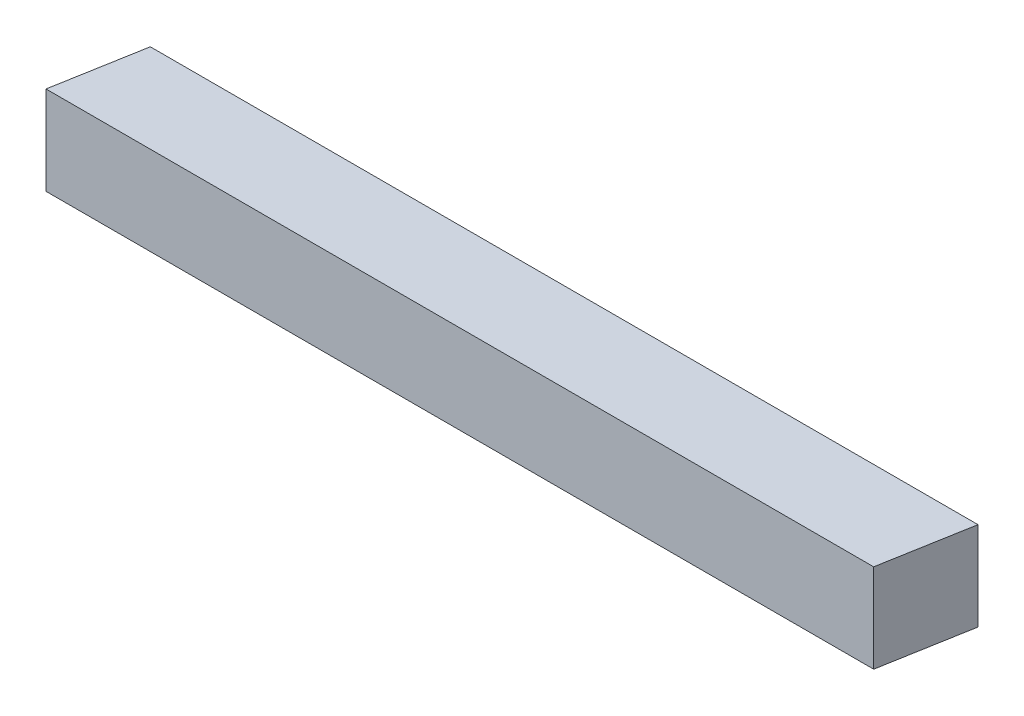
ISO-10303-21;
HEADER;
FILE_DESCRIPTION(('STEP AP214'),'2;1');
FILE_NAME('part.step','',(''),(''),'','','');
FILE_SCHEMA(('AUTOMOTIVE_DESIGN { 1 0 10303 214 1 1 1 1 }'));
ENDSEC;
DATA;
#1=APPLICATION_CONTEXT('core data for automotive mechanical design processes');
#2=APPLICATION_PROTOCOL_DEFINITION('international standard','automotive_design',2000,#1);
#3=PRODUCT_CONTEXT('',#1,'mechanical');
#4=PRODUCT('Part','Part','',(#3));
#5=PRODUCT_RELATED_PRODUCT_CATEGORY('part','',(#4));
#6=PRODUCT_DEFINITION_FORMATION('','',#4);
#7=PRODUCT_DEFINITION_CONTEXT('part definition',#1,'design');
#8=PRODUCT_DEFINITION('design','',#6,#7);
#9=PRODUCT_DEFINITION_SHAPE('','',#8);
#10=(LENGTH_UNIT() NAMED_UNIT(*) SI_UNIT(.MILLI.,.METRE.));
#11=(NAMED_UNIT(*) PLANE_ANGLE_UNIT() SI_UNIT($,.RADIAN.));
#12=(NAMED_UNIT(*) SI_UNIT($,.STERADIAN.) SOLID_ANGLE_UNIT());
#13=UNCERTAINTY_MEASURE_WITH_UNIT(LENGTH_MEASURE(1.E-05),#10,'distance_accuracy_value','');
#14=(GEOMETRIC_REPRESENTATION_CONTEXT(3) GLOBAL_UNCERTAINTY_ASSIGNED_CONTEXT((#13)) GLOBAL_UNIT_ASSIGNED_CONTEXT((#10,
#11,#12)) REPRESENTATION_CONTEXT('',''));
#15=CARTESIAN_POINT('',(0.,0.,0.));
#16=DIRECTION('',(0.,0.,1.));
#17=DIRECTION('',(1.,0.,0.));
#18=AXIS2_PLACEMENT_3D('',#15,#16,#17);
#19=CARTESIAN_POINT('',(-30.7387730658491,19.05,22.5433161953728));
#20=DIRECTION('',(0.,0.,1.));
#21=DIRECTION('',(1.,0.,0.));
#22=AXIS2_PLACEMENT_3D('',#19,#20,#21);
#23=PLANE('',#22);
#24=DIRECTION('',(-1.,0.,0.));
#25=VECTOR('',#24,1.);
#26=CARTESIAN_POINT('',(-30.7387730658491,0.,22.5433161953728));
#27=LINE('',#26,#25);
#28=CARTESIAN_POINT('',(147.061226934151,0.,22.5433161953728));
#29=VERTEX_POINT('',#28);
#30=CARTESIAN_POINT('',(-30.7387730658491,0.,22.5433161953728));
#31=VERTEX_POINT('',#30);
#32=EDGE_CURVE('E105',#29,#31,#27,.T.);
#33=ORIENTED_EDGE('',*,*,#32,.T.);
#34=DIRECTION('',(0.,-1.,0.));
#35=VECTOR('',#34,1.);
#36=CARTESIAN_POINT('',(-30.7387730658491,19.05,22.5433161953728));
#37=LINE('',#36,#35);
#38=CARTESIAN_POINT('',(-30.7387730658491,19.05,22.5433161953728));
#39=VERTEX_POINT('',#38);
#40=EDGE_CURVE('E11',#39,#31,#37,.T.);
#41=ORIENTED_EDGE('',*,*,#40,.F.);
#42=DIRECTION('',(-1.,0.,0.));
#43=VECTOR('',#42,1.);
#44=CARTESIAN_POINT('',(-30.7387730658491,19.05,22.5433161953728));
#45=LINE('',#44,#43);
#46=CARTESIAN_POINT('',(147.061226934151,19.05,22.5433161953728));
#47=VERTEX_POINT('',#46);
#48=EDGE_CURVE('E89',#47,#39,#45,.T.);
#49=ORIENTED_EDGE('',*,*,#48,.F.);
#50=DIRECTION('',(0.,-1.,0.));
#51=VECTOR('',#50,1.);
#52=CARTESIAN_POINT('',(147.061226934151,19.05,22.5433161953728));
#53=LINE('',#52,#51);
#54=EDGE_CURVE('E97',#47,#29,#53,.T.);
#55=ORIENTED_EDGE('',*,*,#54,.T.);
#56=EDGE_LOOP('',(#33,#41,#49,#55));
#57=FACE_BOUND('',#56,.T.);
#58=ADVANCED_FACE('F39',(#57),#23,.F.);
#59=CARTESIAN_POINT('',(-34.0978020483455,19.05,41.5933161953728));
#60=DIRECTION('',(0.984807753012207,0.,0.173648177666934));
#61=DIRECTION('',(0.173648177666934,0.,-0.984807753012207));
#62=AXIS2_PLACEMENT_3D('',#59,#60,#61);
#63=PLANE('',#62);
#64=DIRECTION('',(-0.173648177666934,0.,0.984807753012207));
#65=VECTOR('',#64,1.);
#66=CARTESIAN_POINT('',(-34.0978020483455,0.,41.5933161953728));
#67=LINE('',#66,#65);
#68=CARTESIAN_POINT('',(-34.0978020483455,0.,41.5933161953728));
#69=VERTEX_POINT('',#68);
#70=EDGE_CURVE('E92',#31,#69,#67,.T.);
#71=ORIENTED_EDGE('',*,*,#70,.T.);
#72=DIRECTION('',(0.,-1.,0.));
#73=VECTOR('',#72,1.);
#74=CARTESIAN_POINT('',(-34.0978020483455,19.05,41.5933161953728));
#75=LINE('',#74,#73);
#76=CARTESIAN_POINT('',(-34.0978020483455,19.05,41.5933161953728));
#77=VERTEX_POINT('',#76);
#78=EDGE_CURVE('E50',#77,#69,#75,.T.);
#79=ORIENTED_EDGE('',*,*,#78,.F.);
#80=DIRECTION('',(-0.173648177666934,0.,0.984807753012207));
#81=VECTOR('',#80,1.);
#82=CARTESIAN_POINT('',(-34.0978020483455,19.05,41.5933161953728));
#83=LINE('',#82,#81);
#84=EDGE_CURVE('E82',#39,#77,#83,.T.);
#85=ORIENTED_EDGE('',*,*,#84,.F.);
#86=ORIENTED_EDGE('',*,*,#40,.T.);
#87=EDGE_LOOP('',(#71,#79,#85,#86));
#88=FACE_BOUND('',#87,.T.);
#89=ADVANCED_FACE('F93',(#88),#63,.F.);
#90=CARTESIAN_POINT('',(143.702197951655,19.05,41.5933161953728));
#91=DIRECTION('',(0.,0.,-1.));
#92=DIRECTION('',(-1.,0.,0.));
#93=AXIS2_PLACEMENT_3D('',#90,#91,#92);
#94=PLANE('',#93);
#95=DIRECTION('',(1.,0.,0.));
#96=VECTOR('',#95,1.);
#97=CARTESIAN_POINT('',(143.702197951655,0.,41.5933161953728));
#98=LINE('',#97,#96);
#99=CARTESIAN_POINT('',(143.702197951655,0.,41.5933161953728));
#100=VERTEX_POINT('',#99);
#101=EDGE_CURVE('E72',#69,#100,#98,.T.);
#102=ORIENTED_EDGE('',*,*,#101,.T.);
#103=DIRECTION('',(0.,-1.,0.));
#104=VECTOR('',#103,1.);
#105=CARTESIAN_POINT('',(143.702197951655,19.05,41.5933161953728));
#106=LINE('',#105,#104);
#107=CARTESIAN_POINT('',(143.702197951655,19.05,41.5933161953728));
#108=VERTEX_POINT('',#107);
#109=EDGE_CURVE('E94',#108,#100,#106,.T.);
#110=ORIENTED_EDGE('',*,*,#109,.F.);
#111=DIRECTION('',(1.,0.,0.));
#112=VECTOR('',#111,1.);
#113=CARTESIAN_POINT('',(143.702197951655,19.05,41.5933161953728));
#114=LINE('',#113,#112);
#115=EDGE_CURVE('E88',#77,#108,#114,.T.);
#116=ORIENTED_EDGE('',*,*,#115,.F.);
#117=ORIENTED_EDGE('',*,*,#78,.T.);
#118=EDGE_LOOP('',(#102,#110,#116,#117));
#119=FACE_BOUND('',#118,.T.);
#120=ADVANCED_FACE('F96',(#119),#94,.F.);
#121=CARTESIAN_POINT('',(143.702197951655,19.05,41.5933161953728));
#122=DIRECTION('',(-0.984807753012209,0.,-0.173648177666927));
#123=DIRECTION('',(-0.173648177666927,0.,0.984807753012209));
#124=AXIS2_PLACEMENT_3D('',#121,#122,#123);
#125=PLANE('',#124);
#126=DIRECTION('',(0.173648177666927,0.,-0.984807753012209));
#127=VECTOR('',#126,1.);
#128=CARTESIAN_POINT('',(143.702197951655,0.,41.5933161953728));
#129=LINE('',#128,#127);
#130=EDGE_CURVE('E76',#100,#29,#129,.T.);
#131=ORIENTED_EDGE('',*,*,#130,.T.);
#132=ORIENTED_EDGE('',*,*,#54,.F.);
#133=DIRECTION('',(0.173648177666927,0.,-0.984807753012209));
#134=VECTOR('',#133,1.);
#135=CARTESIAN_POINT('',(143.702197951655,19.05,41.5933161953728));
#136=LINE('',#135,#134);
#137=EDGE_CURVE('E54',#108,#47,#136,.T.);
#138=ORIENTED_EDGE('',*,*,#137,.F.);
#139=ORIENTED_EDGE('',*,*,#109,.T.);
#140=EDGE_LOOP('',(#131,#132,#138,#139));
#141=FACE_BOUND('',#140,.T.);
#142=ADVANCED_FACE('F108',(#141),#125,.F.);
#143=CARTESIAN_POINT('',(0.,19.05,0.));
#144=DIRECTION('',(0.,1.,0.));
#145=DIRECTION('',(0.,0.,1.));
#146=AXIS2_PLACEMENT_3D('',#143,#144,#145);
#147=PLANE('',#146);
#148=ORIENTED_EDGE('',*,*,#48,.T.);
#149=ORIENTED_EDGE('',*,*,#84,.T.);
#150=ORIENTED_EDGE('',*,*,#115,.T.);
#151=ORIENTED_EDGE('',*,*,#137,.T.);
#152=EDGE_LOOP('',(#148,#149,#150,#151));
#153=FACE_BOUND('',#152,.T.);
#154=ADVANCED_FACE('F86',(#153),#147,.T.);
#155=CARTESIAN_POINT('',(0.,0.,0.));
#156=DIRECTION('',(0.,1.,0.));
#157=DIRECTION('',(0.,0.,1.));
#158=AXIS2_PLACEMENT_3D('',#155,#156,#157);
#159=PLANE('',#158);
#160=ORIENTED_EDGE('',*,*,#32,.F.);
#161=ORIENTED_EDGE('',*,*,#130,.F.);
#162=ORIENTED_EDGE('',*,*,#101,.F.);
#163=ORIENTED_EDGE('',*,*,#70,.F.);
#164=EDGE_LOOP('',(#160,#161,#162,#163));
#165=FACE_BOUND('',#164,.T.);
#166=ADVANCED_FACE('F115',(#165),#159,.F.);
#167=CLOSED_SHELL('',(#58,#89,#120,#142,#154,#166));
#168=MANIFOLD_SOLID_BREP('B2',#167);
#169=ADVANCED_BREP_SHAPE_REPRESENTATION('',(#18,#168),#14);
#170=SHAPE_DEFINITION_REPRESENTATION(#9,#169);
ENDSEC;
END-ISO-10303-21;
